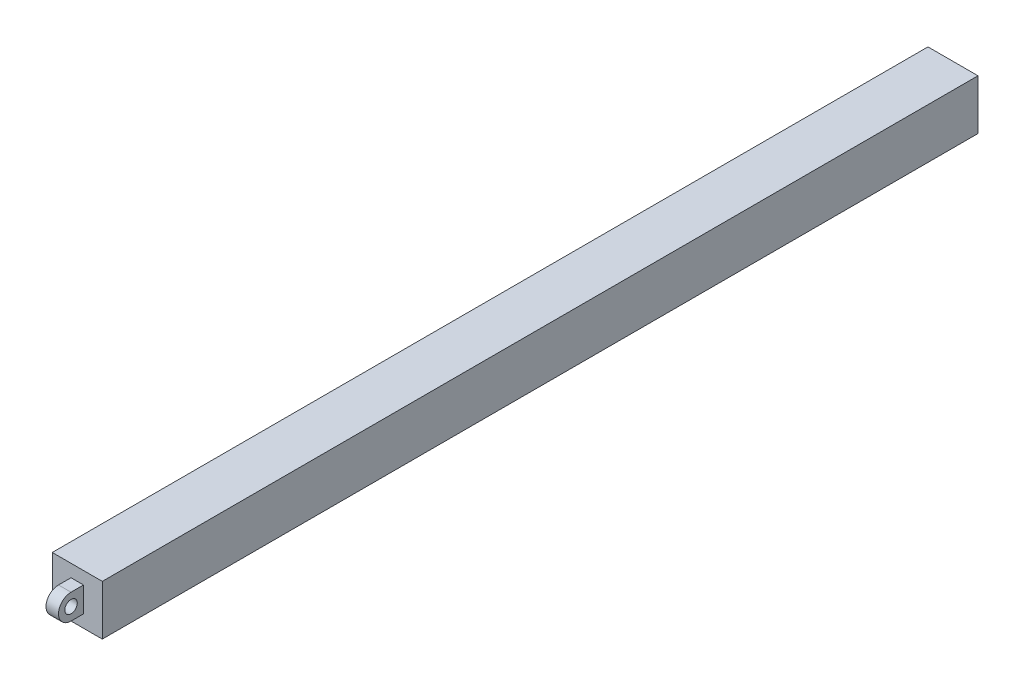
ISO-10303-21;
HEADER;
FILE_DESCRIPTION(('STEP AP214'),'2;1');
FILE_NAME('part.step','',(''),(''),'','','');
FILE_SCHEMA(('AUTOMOTIVE_DESIGN { 1 0 10303 214 1 1 1 1 }'));
ENDSEC;
DATA;
#1=APPLICATION_CONTEXT('core data for automotive mechanical design processes');
#2=APPLICATION_PROTOCOL_DEFINITION('international standard','automotive_design',2000,#1);
#3=PRODUCT_CONTEXT('',#1,'mechanical');
#4=PRODUCT('Part','Part','',(#3));
#5=PRODUCT_RELATED_PRODUCT_CATEGORY('part','',(#4));
#6=PRODUCT_DEFINITION_FORMATION('','',#4);
#7=PRODUCT_DEFINITION_CONTEXT('part definition',#1,'design');
#8=PRODUCT_DEFINITION('design','',#6,#7);
#9=PRODUCT_DEFINITION_SHAPE('','',#8);
#10=(LENGTH_UNIT() NAMED_UNIT(*) SI_UNIT(.MILLI.,.METRE.));
#11=(NAMED_UNIT(*) PLANE_ANGLE_UNIT() SI_UNIT($,.RADIAN.));
#12=(NAMED_UNIT(*) SI_UNIT($,.STERADIAN.) SOLID_ANGLE_UNIT());
#13=UNCERTAINTY_MEASURE_WITH_UNIT(LENGTH_MEASURE(1.E-05),#10,'distance_accuracy_value','');
#14=(GEOMETRIC_REPRESENTATION_CONTEXT(3) GLOBAL_UNCERTAINTY_ASSIGNED_CONTEXT((#13)) GLOBAL_UNIT_ASSIGNED_CONTEXT((#10,
#11,#12)) REPRESENTATION_CONTEXT('',''));
#15=CARTESIAN_POINT('',(0.,0.,0.));
#16=DIRECTION('',(0.,0.,1.));
#17=DIRECTION('',(1.,0.,0.));
#18=AXIS2_PLACEMENT_3D('',#15,#16,#17);
#19=CARTESIAN_POINT('',(5.,5.,87.5));
#20=DIRECTION('',(0.,0.,-1.));
#21=DIRECTION('',(-1.,0.,0.));
#22=AXIS2_PLACEMENT_3D('',#19,#20,#21);
#23=PLANE('',#22);
#24=DIRECTION('',(0.,-1.,0.));
#25=VECTOR('',#24,1.);
#26=CARTESIAN_POINT('',(-5.,5.,87.5));
#27=LINE('',#26,#25);
#28=CARTESIAN_POINT('',(-5.,5.,87.5));
#29=VERTEX_POINT('',#28);
#30=CARTESIAN_POINT('',(-5.,-5.,87.5));
#31=VERTEX_POINT('',#30);
#32=EDGE_CURVE('E117',#29,#31,#27,.T.);
#33=ORIENTED_EDGE('',*,*,#32,.T.);
#34=DIRECTION('',(-1.,0.,0.));
#35=VECTOR('',#34,1.);
#36=CARTESIAN_POINT('',(5.,-5.,87.5));
#37=LINE('',#36,#35);
#38=CARTESIAN_POINT('',(5.,-5.,87.5));
#39=VERTEX_POINT('',#38);
#40=EDGE_CURVE('E11',#39,#31,#37,.T.);
#41=ORIENTED_EDGE('',*,*,#40,.F.);
#42=DIRECTION('',(0.,-1.,0.));
#43=VECTOR('',#42,1.);
#44=CARTESIAN_POINT('',(5.,5.,87.5));
#45=LINE('',#44,#43);
#46=CARTESIAN_POINT('',(5.,5.,87.5));
#47=VERTEX_POINT('',#46);
#48=EDGE_CURVE('E126',#47,#39,#45,.T.);
#49=ORIENTED_EDGE('',*,*,#48,.F.);
#50=DIRECTION('',(-1.,0.,0.));
#51=VECTOR('',#50,1.);
#52=CARTESIAN_POINT('',(5.,5.,87.5));
#53=LINE('',#52,#51);
#54=EDGE_CURVE('E135',#47,#29,#53,.T.);
#55=ORIENTED_EDGE('',*,*,#54,.T.);
#56=EDGE_LOOP('',(#33,#41,#49,#55));
#57=FACE_BOUND('',#56,.T.);
#58=DIRECTION('',(-1.,0.,0.));
#59=VECTOR('',#58,1.);
#60=CARTESIAN_POINT('',(1.25,-2.5,87.5));
#61=LINE('',#60,#59);
#62=CARTESIAN_POINT('',(1.25,-2.5,87.5));
#63=VERTEX_POINT('',#62);
#64=CARTESIAN_POINT('',(-1.25,-2.5,87.5));
#65=VERTEX_POINT('',#64);
#66=EDGE_CURVE('E52',#63,#65,#61,.T.);
#67=ORIENTED_EDGE('',*,*,#66,.T.);
#68=DIRECTION('',(0.,1.,0.));
#69=VECTOR('',#68,1.);
#70=CARTESIAN_POINT('',(-1.25,2.5,87.5));
#71=LINE('',#70,#69);
#72=CARTESIAN_POINT('',(-1.25,2.5,87.5));
#73=VERTEX_POINT('',#72);
#74=EDGE_CURVE('E216',#65,#73,#71,.T.);
#75=ORIENTED_EDGE('',*,*,#74,.T.);
#76=DIRECTION('',(-1.,0.,0.));
#77=VECTOR('',#76,1.);
#78=CARTESIAN_POINT('',(1.25,2.5,87.5));
#79=LINE('',#78,#77);
#80=CARTESIAN_POINT('',(1.25,2.5,87.5));
#81=VERTEX_POINT('',#80);
#82=EDGE_CURVE('E122',#81,#73,#79,.T.);
#83=ORIENTED_EDGE('',*,*,#82,.F.);
#84=DIRECTION('',(0.,1.,0.));
#85=VECTOR('',#84,1.);
#86=CARTESIAN_POINT('',(1.25,2.5,87.5));
#87=LINE('',#86,#85);
#88=EDGE_CURVE('E47',#63,#81,#87,.T.);
#89=ORIENTED_EDGE('',*,*,#88,.F.);
#90=EDGE_LOOP('',(#67,#75,#83,#89));
#91=FACE_BOUND('',#90,.T.);
#92=ADVANCED_FACE('F33',(#57,#91),#23,.F.);
#93=CARTESIAN_POINT('',(5.,-5.,87.5));
#94=DIRECTION('',(0.,1.,0.));
#95=DIRECTION('',(0.,0.,1.));
#96=AXIS2_PLACEMENT_3D('',#93,#94,#95);
#97=PLANE('',#96);
#98=DIRECTION('',(0.,0.,-1.));
#99=VECTOR('',#98,1.);
#100=CARTESIAN_POINT('',(-5.,-5.,87.5));
#101=LINE('',#100,#99);
#102=CARTESIAN_POINT('',(-5.,-5.,-87.5));
#103=VERTEX_POINT('',#102);
#104=EDGE_CURVE('E120',#31,#103,#101,.T.);
#105=ORIENTED_EDGE('',*,*,#104,.T.);
#106=DIRECTION('',(-1.,0.,0.));
#107=VECTOR('',#106,1.);
#108=CARTESIAN_POINT('',(5.,-5.,-87.5));
#109=LINE('',#108,#107);
#110=CARTESIAN_POINT('',(5.,-5.,-87.5));
#111=VERTEX_POINT('',#110);
#112=EDGE_CURVE('E40',#111,#103,#109,.T.);
#113=ORIENTED_EDGE('',*,*,#112,.F.);
#114=DIRECTION('',(0.,0.,-1.));
#115=VECTOR('',#114,1.);
#116=CARTESIAN_POINT('',(5.,-5.,87.5));
#117=LINE('',#116,#115);
#118=EDGE_CURVE('E129',#39,#111,#117,.T.);
#119=ORIENTED_EDGE('',*,*,#118,.F.);
#120=ORIENTED_EDGE('',*,*,#40,.T.);
#121=EDGE_LOOP('',(#105,#113,#119,#120));
#122=FACE_BOUND('',#121,.T.);
#123=ADVANCED_FACE('F166',(#122),#97,.F.);
#124=CARTESIAN_POINT('',(5.,5.,-87.5));
#125=DIRECTION('',(0.,0.,1.));
#126=DIRECTION('',(1.,0.,0.));
#127=AXIS2_PLACEMENT_3D('',#124,#125,#126);
#128=PLANE('',#127);
#129=DIRECTION('',(0.,1.,0.));
#130=VECTOR('',#129,1.);
#131=CARTESIAN_POINT('',(-5.,5.,-87.5));
#132=LINE('',#131,#130);
#133=CARTESIAN_POINT('',(-5.,5.,-87.5));
#134=VERTEX_POINT('',#133);
#135=EDGE_CURVE('E138',#103,#134,#132,.T.);
#136=ORIENTED_EDGE('',*,*,#135,.T.);
#137=DIRECTION('',(-1.,0.,0.));
#138=VECTOR('',#137,1.);
#139=CARTESIAN_POINT('',(5.,5.,-87.5));
#140=LINE('',#139,#138);
#141=CARTESIAN_POINT('',(5.,5.,-87.5));
#142=VERTEX_POINT('',#141);
#143=EDGE_CURVE('E143',#142,#134,#140,.T.);
#144=ORIENTED_EDGE('',*,*,#143,.F.);
#145=DIRECTION('',(0.,1.,0.));
#146=VECTOR('',#145,1.);
#147=CARTESIAN_POINT('',(5.,5.,-87.5));
#148=LINE('',#147,#146);
#149=EDGE_CURVE('E132',#111,#142,#148,.T.);
#150=ORIENTED_EDGE('',*,*,#149,.F.);
#151=ORIENTED_EDGE('',*,*,#112,.T.);
#152=EDGE_LOOP('',(#136,#144,#150,#151));
#153=FACE_BOUND('',#152,.T.);
#154=ADVANCED_FACE('F150',(#153),#128,.F.);
#155=CARTESIAN_POINT('',(5.,5.,87.5));
#156=DIRECTION('',(0.,-1.,0.));
#157=DIRECTION('',(0.,0.,-1.));
#158=AXIS2_PLACEMENT_3D('',#155,#156,#157);
#159=PLANE('',#158);
#160=DIRECTION('',(0.,0.,1.));
#161=VECTOR('',#160,1.);
#162=CARTESIAN_POINT('',(-5.,5.,87.5));
#163=LINE('',#162,#161);
#164=EDGE_CURVE('E130',#134,#29,#163,.T.);
#165=ORIENTED_EDGE('',*,*,#164,.T.);
#166=ORIENTED_EDGE('',*,*,#54,.F.);
#167=DIRECTION('',(0.,0.,1.));
#168=VECTOR('',#167,1.);
#169=CARTESIAN_POINT('',(5.,5.,87.5));
#170=LINE('',#169,#168);
#171=EDGE_CURVE('E134',#142,#47,#170,.T.);
#172=ORIENTED_EDGE('',*,*,#171,.F.);
#173=ORIENTED_EDGE('',*,*,#143,.T.);
#174=EDGE_LOOP('',(#165,#166,#172,#173));
#175=FACE_BOUND('',#174,.T.);
#176=ADVANCED_FACE('F159',(#175),#159,.F.);
#177=CARTESIAN_POINT('',(5.,0.,0.));
#178=DIRECTION('',(1.,0.,0.));
#179=DIRECTION('',(0.,0.,-1.));
#180=AXIS2_PLACEMENT_3D('',#177,#178,#179);
#181=PLANE('',#180);
#182=ORIENTED_EDGE('',*,*,#48,.T.);
#183=ORIENTED_EDGE('',*,*,#118,.T.);
#184=ORIENTED_EDGE('',*,*,#149,.T.);
#185=ORIENTED_EDGE('',*,*,#171,.T.);
#186=EDGE_LOOP('',(#182,#183,#184,#185));
#187=FACE_BOUND('',#186,.T.);
#188=ADVANCED_FACE('F165',(#187),#181,.T.);
#189=CARTESIAN_POINT('',(-5.,0.,0.));
#190=DIRECTION('',(1.,0.,0.));
#191=DIRECTION('',(0.,0.,-1.));
#192=AXIS2_PLACEMENT_3D('',#189,#190,#191);
#193=PLANE('',#192);
#194=ORIENTED_EDGE('',*,*,#32,.F.);
#195=ORIENTED_EDGE('',*,*,#164,.F.);
#196=ORIENTED_EDGE('',*,*,#135,.F.);
#197=ORIENTED_EDGE('',*,*,#104,.F.);
#198=EDGE_LOOP('',(#194,#195,#196,#197));
#199=FACE_BOUND('',#198,.T.);
#200=ADVANCED_FACE('F156',(#199),#193,.F.);
#201=CARTESIAN_POINT('',(1.25,0.,90.));
#202=DIRECTION('',(1.,0.,0.));
#203=DIRECTION('',(0.,0.,-1.));
#204=AXIS2_PLACEMENT_3D('',#201,#202,#203);
#205=PLANE('',#204);
#206=CARTESIAN_POINT('',(1.25,0.,90.));
#207=DIRECTION('',(1.,0.,0.));
#208=DIRECTION('',(0.,0.,-1.));
#209=AXIS2_PLACEMENT_3D('',#206,#207,#208);
#210=CIRCLE('',#209,2.5);
#211=CARTESIAN_POINT('',(1.25,2.5,90.));
#212=VERTEX_POINT('',#211);
#213=CARTESIAN_POINT('',(1.25,-2.5,90.));
#214=VERTEX_POINT('',#213);
#215=EDGE_CURVE('E102',#212,#214,#210,.T.);
#216=ORIENTED_EDGE('',*,*,#215,.T.);
#217=DIRECTION('',(0.,0.,-1.));
#218=VECTOR('',#217,1.);
#219=CARTESIAN_POINT('',(1.25,-2.5,90.));
#220=LINE('',#219,#218);
#221=EDGE_CURVE('E95',#214,#63,#220,.T.);
#222=ORIENTED_EDGE('',*,*,#221,.T.);
#223=ORIENTED_EDGE('',*,*,#88,.T.);
#224=DIRECTION('',(0.,0.,1.));
#225=VECTOR('',#224,1.);
#226=CARTESIAN_POINT('',(1.25,2.5,90.));
#227=LINE('',#226,#225);
#228=EDGE_CURVE('E108',#81,#212,#227,.T.);
#229=ORIENTED_EDGE('',*,*,#228,.T.);
#230=EDGE_LOOP('',(#216,#222,#223,#229));
#231=FACE_BOUND('',#230,.T.);
#232=CARTESIAN_POINT('',(1.25,0.,90.));
#233=DIRECTION('',(1.,0.,0.));
#234=DIRECTION('',(0.,0.,-1.));
#235=AXIS2_PLACEMENT_3D('',#232,#233,#234);
#236=CIRCLE('',#235,1.25);
#237=CARTESIAN_POINT('',(1.25,0.,88.75));
#238=VERTEX_POINT('',#237);
#239=EDGE_CURVE('E202',#238,#238,#236,.T.);
#240=ORIENTED_EDGE('',*,*,#239,.F.);
#241=EDGE_LOOP('',(#240));
#242=FACE_BOUND('',#241,.T.);
#243=ADVANCED_FACE('F105',(#231,#242),#205,.T.);
#244=CARTESIAN_POINT('',(-1.25,0.,90.));
#245=DIRECTION('',(1.,0.,0.));
#246=DIRECTION('',(0.,0.,-1.));
#247=AXIS2_PLACEMENT_3D('',#244,#245,#246);
#248=PLANE('',#247);
#249=CARTESIAN_POINT('',(-1.25,0.,90.));
#250=DIRECTION('',(1.,0.,0.));
#251=DIRECTION('',(0.,0.,-1.));
#252=AXIS2_PLACEMENT_3D('',#249,#250,#251);
#253=CIRCLE('',#252,2.5);
#254=CARTESIAN_POINT('',(-1.25,2.5,90.));
#255=VERTEX_POINT('',#254);
#256=CARTESIAN_POINT('',(-1.25,-2.5,90.));
#257=VERTEX_POINT('',#256);
#258=EDGE_CURVE('E116',#255,#257,#253,.T.);
#259=ORIENTED_EDGE('',*,*,#258,.F.);
#260=DIRECTION('',(0.,0.,1.));
#261=VECTOR('',#260,1.);
#262=CARTESIAN_POINT('',(-1.25,2.5,90.));
#263=LINE('',#262,#261);
#264=EDGE_CURVE('E112',#73,#255,#263,.T.);
#265=ORIENTED_EDGE('',*,*,#264,.F.);
#266=ORIENTED_EDGE('',*,*,#74,.F.);
#267=DIRECTION('',(0.,0.,-1.));
#268=VECTOR('',#267,1.);
#269=CARTESIAN_POINT('',(-1.25,-2.5,90.));
#270=LINE('',#269,#268);
#271=EDGE_CURVE('E214',#257,#65,#270,.T.);
#272=ORIENTED_EDGE('',*,*,#271,.F.);
#273=EDGE_LOOP('',(#259,#265,#266,#272));
#274=FACE_BOUND('',#273,.T.);
#275=CARTESIAN_POINT('',(-1.25,0.,90.));
#276=DIRECTION('',(1.,0.,0.));
#277=DIRECTION('',(0.,0.,-1.));
#278=AXIS2_PLACEMENT_3D('',#275,#276,#277);
#279=CIRCLE('',#278,1.25);
#280=CARTESIAN_POINT('',(-1.25,0.,88.75));
#281=VERTEX_POINT('',#280);
#282=EDGE_CURVE('E205',#281,#281,#279,.T.);
#283=ORIENTED_EDGE('',*,*,#282,.T.);
#284=EDGE_LOOP('',(#283));
#285=FACE_BOUND('',#284,.T.);
#286=ADVANCED_FACE('F182',(#274,#285),#248,.F.);
#287=CARTESIAN_POINT('',(1.25,0.,90.));
#288=DIRECTION('',(-1.,0.,0.));
#289=DIRECTION('',(0.,0.,1.));
#290=AXIS2_PLACEMENT_3D('',#287,#288,#289);
#291=CYLINDRICAL_SURFACE('',#290,2.5);
#292=ORIENTED_EDGE('',*,*,#258,.T.);
#293=DIRECTION('',(-1.,0.,0.));
#294=VECTOR('',#293,1.);
#295=CARTESIAN_POINT('',(1.25,-2.5,90.));
#296=LINE('',#295,#294);
#297=EDGE_CURVE('E99',#214,#257,#296,.T.);
#298=ORIENTED_EDGE('',*,*,#297,.F.);
#299=ORIENTED_EDGE('',*,*,#215,.F.);
#300=DIRECTION('',(-1.,0.,0.));
#301=VECTOR('',#300,1.);
#302=CARTESIAN_POINT('',(1.25,2.5,90.));
#303=LINE('',#302,#301);
#304=EDGE_CURVE('E212',#212,#255,#303,.T.);
#305=ORIENTED_EDGE('',*,*,#304,.T.);
#306=EDGE_LOOP('',(#292,#298,#299,#305));
#307=FACE_BOUND('',#306,.T.);
#308=ADVANCED_FACE('F114',(#307),#291,.T.);
#309=CARTESIAN_POINT('',(1.25,-2.5,90.));
#310=DIRECTION('',(0.,1.,0.));
#311=DIRECTION('',(0.,0.,1.));
#312=AXIS2_PLACEMENT_3D('',#309,#310,#311);
#313=PLANE('',#312);
#314=ORIENTED_EDGE('',*,*,#271,.T.);
#315=ORIENTED_EDGE('',*,*,#66,.F.);
#316=ORIENTED_EDGE('',*,*,#221,.F.);
#317=ORIENTED_EDGE('',*,*,#297,.T.);
#318=EDGE_LOOP('',(#314,#315,#316,#317));
#319=FACE_BOUND('',#318,.T.);
#320=ADVANCED_FACE('F97',(#319),#313,.F.);
#321=CARTESIAN_POINT('',(1.25,2.5,90.));
#322=DIRECTION('',(0.,-1.,0.));
#323=DIRECTION('',(0.,0.,-1.));
#324=AXIS2_PLACEMENT_3D('',#321,#322,#323);
#325=PLANE('',#324);
#326=ORIENTED_EDGE('',*,*,#264,.T.);
#327=ORIENTED_EDGE('',*,*,#304,.F.);
#328=ORIENTED_EDGE('',*,*,#228,.F.);
#329=ORIENTED_EDGE('',*,*,#82,.T.);
#330=EDGE_LOOP('',(#326,#327,#328,#329));
#331=FACE_BOUND('',#330,.T.);
#332=ADVANCED_FACE('F185',(#331),#325,.F.);
#333=CARTESIAN_POINT('',(1.25,0.,90.));
#334=DIRECTION('',(-1.,0.,0.));
#335=DIRECTION('',(0.,0.,1.));
#336=AXIS2_PLACEMENT_3D('',#333,#334,#335);
#337=CYLINDRICAL_SURFACE('',#336,1.25);
#338=ORIENTED_EDGE('',*,*,#239,.T.);
#339=EDGE_LOOP('',(#338));
#340=FACE_BOUND('',#339,.T.);
#341=ORIENTED_EDGE('',*,*,#282,.F.);
#342=EDGE_LOOP('',(#341));
#343=FACE_BOUND('',#342,.T.);
#344=ADVANCED_FACE('F188',(#340,#343),#337,.F.);
#345=CLOSED_SHELL('',(#92,#123,#154,#176,#188,#200,#243,#286,#308,#320,#332,#344));
#346=MANIFOLD_SOLID_BREP('B2',#345);
#347=ADVANCED_BREP_SHAPE_REPRESENTATION('',(#18,#346),#14);
#348=SHAPE_DEFINITION_REPRESENTATION(#9,#347);
ENDSEC;
END-ISO-10303-21;
